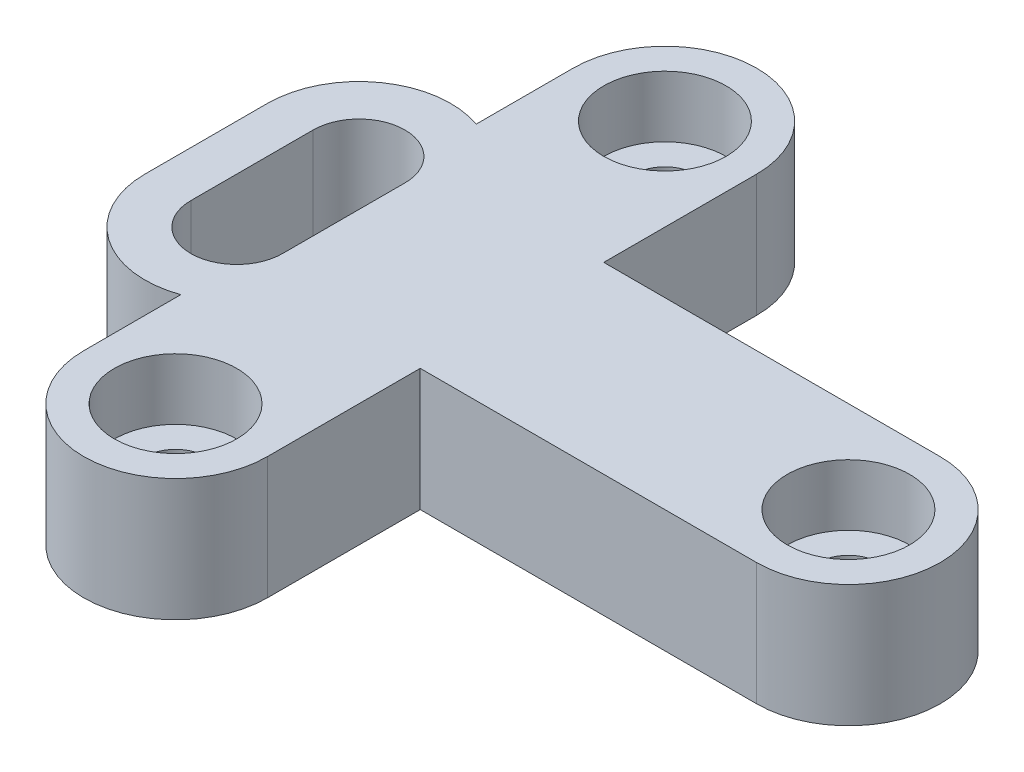
ISO-10303-21;
HEADER;
FILE_DESCRIPTION(('STEP AP214'),'2;1');
FILE_NAME('part.step','',(''),(''),'','','');
FILE_SCHEMA(('AUTOMOTIVE_DESIGN { 1 0 10303 214 1 1 1 1 }'));
ENDSEC;
DATA;
#1=APPLICATION_CONTEXT('core data for automotive mechanical design processes');
#2=APPLICATION_PROTOCOL_DEFINITION('international standard','automotive_design',2000,#1);
#3=PRODUCT_CONTEXT('',#1,'mechanical');
#4=PRODUCT('Part','Part','',(#3));
#5=PRODUCT_RELATED_PRODUCT_CATEGORY('part','',(#4));
#6=PRODUCT_DEFINITION_FORMATION('','',#4);
#7=PRODUCT_DEFINITION_CONTEXT('part definition',#1,'design');
#8=PRODUCT_DEFINITION('design','',#6,#7);
#9=PRODUCT_DEFINITION_SHAPE('','',#8);
#10=(LENGTH_UNIT() NAMED_UNIT(*) SI_UNIT(.MILLI.,.METRE.));
#11=(NAMED_UNIT(*) PLANE_ANGLE_UNIT() SI_UNIT($,.RADIAN.));
#12=(NAMED_UNIT(*) SI_UNIT($,.STERADIAN.) SOLID_ANGLE_UNIT());
#13=UNCERTAINTY_MEASURE_WITH_UNIT(LENGTH_MEASURE(1.E-05),#10,'distance_accuracy_value','');
#14=(GEOMETRIC_REPRESENTATION_CONTEXT(3) GLOBAL_UNCERTAINTY_ASSIGNED_CONTEXT((#13)) GLOBAL_UNIT_ASSIGNED_CONTEXT((#10,
#11,#12)) REPRESENTATION_CONTEXT('',''));
#15=CARTESIAN_POINT('',(0.,0.,0.));
#16=DIRECTION('',(0.,0.,1.));
#17=DIRECTION('',(1.,0.,0.));
#18=AXIS2_PLACEMENT_3D('',#15,#16,#17);
#19=CARTESIAN_POINT('',(20.,10.,40.));
#20=DIRECTION('',(0.,-1.,0.));
#21=DIRECTION('',(0.,0.,-1.));
#22=AXIS2_PLACEMENT_3D('',#19,#20,#21);
#23=CYLINDRICAL_SURFACE('',#22,5.00000000000001);
#24=CARTESIAN_POINT('',(20.,-10.,40.));
#25=DIRECTION('',(0.,1.,0.));
#26=DIRECTION('',(0.,0.,1.));
#27=AXIS2_PLACEMENT_3D('',#24,#25,#26);
#28=CIRCLE('',#27,5.00000000000001);
#29=CARTESIAN_POINT('',(20.,-10.,45.));
#30=VERTEX_POINT('',#29);
#31=EDGE_CURVE('E195',#30,#30,#28,.T.);
#32=ORIENTED_EDGE('',*,*,#31,.F.);
#33=EDGE_LOOP('',(#32));
#34=FACE_BOUND('',#33,.T.);
#35=CARTESIAN_POINT('',(20.,0.,40.));
#36=DIRECTION('',(0.,1.,0.));
#37=DIRECTION('',(0.,0.,1.));
#38=AXIS2_PLACEMENT_3D('',#35,#36,#37);
#39=CIRCLE('',#38,5.00000000000001);
#40=CARTESIAN_POINT('',(20.,0.,45.));
#41=VERTEX_POINT('',#40);
#42=EDGE_CURVE('E41',#41,#41,#39,.T.);
#43=ORIENTED_EDGE('',*,*,#42,.T.);
#44=EDGE_LOOP('',(#43));
#45=FACE_BOUND('',#44,.T.);
#46=ADVANCED_FACE('F37',(#34,#45),#23,.F.);
#47=CARTESIAN_POINT('',(20.,10.,-40.));
#48=DIRECTION('',(0.,-1.,0.));
#49=DIRECTION('',(0.,0.,-1.));
#50=AXIS2_PLACEMENT_3D('',#47,#48,#49);
#51=CYLINDRICAL_SURFACE('',#50,5.00000000000001);
#52=CARTESIAN_POINT('',(20.,-10.,-40.));
#53=DIRECTION('',(0.,1.,0.));
#54=DIRECTION('',(0.,0.,1.));
#55=AXIS2_PLACEMENT_3D('',#52,#53,#54);
#56=CIRCLE('',#55,5.00000000000001);
#57=CARTESIAN_POINT('',(20.,-10.,-35.));
#58=VERTEX_POINT('',#57);
#59=EDGE_CURVE('E192',#58,#58,#56,.T.);
#60=ORIENTED_EDGE('',*,*,#59,.F.);
#61=EDGE_LOOP('',(#60));
#62=FACE_BOUND('',#61,.T.);
#63=CARTESIAN_POINT('',(20.,0.,-40.));
#64=DIRECTION('',(0.,1.,0.));
#65=DIRECTION('',(0.,0.,1.));
#66=AXIS2_PLACEMENT_3D('',#63,#64,#65);
#67=CIRCLE('',#66,5.00000000000001);
#68=CARTESIAN_POINT('',(20.,0.,-35.));
#69=VERTEX_POINT('',#68);
#70=EDGE_CURVE('E282',#69,#69,#67,.T.);
#71=ORIENTED_EDGE('',*,*,#70,.T.);
#72=EDGE_LOOP('',(#71));
#73=FACE_BOUND('',#72,.T.);
#74=ADVANCED_FACE('F404',(#62,#73),#51,.F.);
#75=CARTESIAN_POINT('',(90.,10.,0.));
#76=DIRECTION('',(0.,-1.,0.));
#77=DIRECTION('',(0.,0.,-1.));
#78=AXIS2_PLACEMENT_3D('',#75,#76,#77);
#79=CYLINDRICAL_SURFACE('',#78,4.99999999999999);
#80=CARTESIAN_POINT('',(90.,-10.,0.));
#81=DIRECTION('',(0.,1.,0.));
#82=DIRECTION('',(0.,0.,1.));
#83=AXIS2_PLACEMENT_3D('',#80,#81,#82);
#84=CIRCLE('',#83,4.99999999999999);
#85=CARTESIAN_POINT('',(90.,-10.,5.));
#86=VERTEX_POINT('',#85);
#87=EDGE_CURVE('E168',#86,#86,#84,.T.);
#88=ORIENTED_EDGE('',*,*,#87,.F.);
#89=EDGE_LOOP('',(#88));
#90=FACE_BOUND('',#89,.T.);
#91=CARTESIAN_POINT('',(90.,0.,0.));
#92=DIRECTION('',(0.,1.,0.));
#93=DIRECTION('',(0.,0.,1.));
#94=AXIS2_PLACEMENT_3D('',#91,#92,#93);
#95=CIRCLE('',#94,4.99999999999999);
#96=CARTESIAN_POINT('',(90.,0.,5.));
#97=VERTEX_POINT('',#96);
#98=EDGE_CURVE('E280',#97,#97,#95,.T.);
#99=ORIENTED_EDGE('',*,*,#98,.T.);
#100=EDGE_LOOP('',(#99));
#101=FACE_BOUND('',#100,.T.);
#102=ADVANCED_FACE('F328',(#90,#101),#79,.F.);
#103=CARTESIAN_POINT('',(20.,10.,-40.));
#104=DIRECTION('',(0.,1.,0.));
#105=DIRECTION('',(0.,0.,1.));
#106=AXIS2_PLACEMENT_3D('',#103,#104,#105);
#107=PLANE('',#106);
#108=CARTESIAN_POINT('',(20.,10.,40.));
#109=DIRECTION('',(0.,1.,0.));
#110=DIRECTION('',(0.,0.,1.));
#111=AXIS2_PLACEMENT_3D('',#108,#109,#110);
#112=CIRCLE('',#111,10.);
#113=CARTESIAN_POINT('',(20.,10.,50.));
#114=VERTEX_POINT('',#113);
#115=EDGE_CURVE('E299',#114,#114,#112,.T.);
#116=ORIENTED_EDGE('',*,*,#115,.F.);
#117=EDGE_LOOP('',(#116));
#118=FACE_BOUND('',#117,.T.);
#119=CARTESIAN_POINT('',(20.,10.,-40.));
#120=DIRECTION('',(0.,1.,0.));
#121=DIRECTION('',(0.,0.,1.));
#122=AXIS2_PLACEMENT_3D('',#119,#120,#121);
#123=CIRCLE('',#122,10.);
#124=CARTESIAN_POINT('',(20.,10.,-30.));
#125=VERTEX_POINT('',#124);
#126=EDGE_CURVE('E302',#125,#125,#123,.T.);
#127=ORIENTED_EDGE('',*,*,#126,.F.);
#128=EDGE_LOOP('',(#127));
#129=FACE_BOUND('',#128,.T.);
#130=CARTESIAN_POINT('',(90.,10.,0.));
#131=DIRECTION('',(0.,1.,0.));
#132=DIRECTION('',(0.,0.,1.));
#133=AXIS2_PLACEMENT_3D('',#130,#131,#132);
#134=CIRCLE('',#133,9.99999999999999);
#135=CARTESIAN_POINT('',(90.,10.,10.));
#136=VERTEX_POINT('',#135);
#137=EDGE_CURVE('E310',#136,#136,#134,.T.);
#138=ORIENTED_EDGE('',*,*,#137,.F.);
#139=EDGE_LOOP('',(#138));
#140=FACE_BOUND('',#139,.T.);
#141=CARTESIAN_POINT('',(20.,10.,-40.));
#142=DIRECTION('',(0.,1.,0.));
#143=DIRECTION('',(0.,0.,1.));
#144=AXIS2_PLACEMENT_3D('',#141,#142,#143);
#145=CIRCLE('',#144,15.);
#146=CARTESIAN_POINT('',(35.,10.,-40.));
#147=VERTEX_POINT('',#146);
#148=CARTESIAN_POINT('',(5.,10.,-40.));
#149=VERTEX_POINT('',#148);
#150=EDGE_CURVE('E199',#147,#149,#145,.T.);
#151=ORIENTED_EDGE('',*,*,#150,.T.);
#152=DIRECTION('',(0.,0.,1.));
#153=VECTOR('',#152,1.);
#154=CARTESIAN_POINT('',(5.,10.,-40.));
#155=LINE('',#154,#153);
#156=CARTESIAN_POINT('',(5.00000000000001,10.,-24.142135623731));
#157=VERTEX_POINT('',#156);
#158=EDGE_CURVE('E202',#149,#157,#155,.T.);
#159=ORIENTED_EDGE('',*,*,#158,.T.);
#160=CARTESIAN_POINT('',(0.,10.,-10.));
#161=DIRECTION('',(0.,1.,0.));
#162=DIRECTION('',(0.,0.,1.));
#163=AXIS2_PLACEMENT_3D('',#160,#161,#162);
#164=CIRCLE('',#163,15.);
#165=CARTESIAN_POINT('',(-15.,10.,-10.));
#166=VERTEX_POINT('',#165);
#167=EDGE_CURVE('E205',#157,#166,#164,.T.);
#168=ORIENTED_EDGE('',*,*,#167,.T.);
#169=DIRECTION('',(0.,0.,1.));
#170=VECTOR('',#169,1.);
#171=CARTESIAN_POINT('',(-15.,10.,-10.));
#172=LINE('',#171,#170);
#173=CARTESIAN_POINT('',(-15.,10.,9.99999999999999));
#174=VERTEX_POINT('',#173);
#175=EDGE_CURVE('E207',#166,#174,#172,.T.);
#176=ORIENTED_EDGE('',*,*,#175,.T.);
#177=CARTESIAN_POINT('',(0.,10.,9.99999999999999));
#178=DIRECTION('',(0.,1.,0.));
#179=DIRECTION('',(0.,0.,1.));
#180=AXIS2_PLACEMENT_3D('',#177,#178,#179);
#181=CIRCLE('',#180,15.);
#182=CARTESIAN_POINT('',(5.00000000000001,10.,24.1421356237309));
#183=VERTEX_POINT('',#182);
#184=EDGE_CURVE('E209',#174,#183,#181,.T.);
#185=ORIENTED_EDGE('',*,*,#184,.T.);
#186=DIRECTION('',(0.,0.,1.));
#187=VECTOR('',#186,1.);
#188=CARTESIAN_POINT('',(5.00000000000001,10.,40.));
#189=LINE('',#188,#187);
#190=CARTESIAN_POINT('',(5.00000000000001,10.,40.));
#191=VERTEX_POINT('',#190);
#192=EDGE_CURVE('E211',#183,#191,#189,.T.);
#193=ORIENTED_EDGE('',*,*,#192,.T.);
#194=CARTESIAN_POINT('',(20.,10.,40.));
#195=DIRECTION('',(0.,1.,0.));
#196=DIRECTION('',(0.,0.,1.));
#197=AXIS2_PLACEMENT_3D('',#194,#195,#196);
#198=CIRCLE('',#197,15.);
#199=CARTESIAN_POINT('',(35.,10.,40.));
#200=VERTEX_POINT('',#199);
#201=EDGE_CURVE('E213',#191,#200,#198,.T.);
#202=ORIENTED_EDGE('',*,*,#201,.T.);
#203=DIRECTION('',(0.,0.,-1.));
#204=VECTOR('',#203,1.);
#205=CARTESIAN_POINT('',(35.,10.,40.));
#206=LINE('',#205,#204);
#207=CARTESIAN_POINT('',(35.,10.,15.));
#208=VERTEX_POINT('',#207);
#209=EDGE_CURVE('E215',#200,#208,#206,.T.);
#210=ORIENTED_EDGE('',*,*,#209,.T.);
#211=DIRECTION('',(1.,0.,0.));
#212=VECTOR('',#211,1.);
#213=CARTESIAN_POINT('',(35.,10.,15.));
#214=LINE('',#213,#212);
#215=CARTESIAN_POINT('',(90.,10.,15.));
#216=VERTEX_POINT('',#215);
#217=EDGE_CURVE('E217',#208,#216,#214,.T.);
#218=ORIENTED_EDGE('',*,*,#217,.T.);
#219=CARTESIAN_POINT('',(90.,10.,0.));
#220=DIRECTION('',(0.,1.,0.));
#221=DIRECTION('',(0.,0.,1.));
#222=AXIS2_PLACEMENT_3D('',#219,#220,#221);
#223=CIRCLE('',#222,15.);
#224=CARTESIAN_POINT('',(90.,10.,-15.));
#225=VERTEX_POINT('',#224);
#226=EDGE_CURVE('E219',#216,#225,#223,.T.);
#227=ORIENTED_EDGE('',*,*,#226,.T.);
#228=DIRECTION('',(-1.,0.,0.));
#229=VECTOR('',#228,1.);
#230=CARTESIAN_POINT('',(90.,10.,-15.));
#231=LINE('',#230,#229);
#232=CARTESIAN_POINT('',(35.,10.,-15.));
#233=VERTEX_POINT('',#232);
#234=EDGE_CURVE('E221',#225,#233,#231,.T.);
#235=ORIENTED_EDGE('',*,*,#234,.T.);
#236=DIRECTION('',(0.,0.,-1.));
#237=VECTOR('',#236,1.);
#238=CARTESIAN_POINT('',(35.,10.,-15.));
#239=LINE('',#238,#237);
#240=EDGE_CURVE('E223',#233,#147,#239,.T.);
#241=ORIENTED_EDGE('',*,*,#240,.T.);
#242=EDGE_LOOP('',(#151,#159,#168,#176,#185,#193,#202,#210,#218,#227,#235,#241));
#243=FACE_BOUND('',#242,.T.);
#244=DIRECTION('',(0.,0.,1.));
#245=VECTOR('',#244,1.);
#246=CARTESIAN_POINT('',(-7.50000000000001,10.,-10.));
#247=LINE('',#246,#245);
#248=CARTESIAN_POINT('',(-7.50000000000001,10.,-10.));
#249=VERTEX_POINT('',#248);
#250=CARTESIAN_POINT('',(-7.5,10.,9.99999999999999));
#251=VERTEX_POINT('',#250);
#252=EDGE_CURVE('E160',#249,#251,#247,.T.);
#253=ORIENTED_EDGE('',*,*,#252,.F.);
#254=CARTESIAN_POINT('',(0.,10.,-10.));
#255=DIRECTION('',(0.,1.,0.));
#256=DIRECTION('',(0.,0.,1.));
#257=AXIS2_PLACEMENT_3D('',#254,#255,#256);
#258=CIRCLE('',#257,7.5);
#259=CARTESIAN_POINT('',(7.5,10.,-10.));
#260=VERTEX_POINT('',#259);
#261=EDGE_CURVE('E152',#260,#249,#258,.T.);
#262=ORIENTED_EDGE('',*,*,#261,.F.);
#263=DIRECTION('',(0.,0.,-1.));
#264=VECTOR('',#263,1.);
#265=CARTESIAN_POINT('',(7.5,10.,-10.));
#266=LINE('',#265,#264);
#267=CARTESIAN_POINT('',(7.50000000000001,10.,9.99999999999999));
#268=VERTEX_POINT('',#267);
#269=EDGE_CURVE('E175',#268,#260,#266,.T.);
#270=ORIENTED_EDGE('',*,*,#269,.F.);
#271=CARTESIAN_POINT('',(0.,10.,9.99999999999999));
#272=DIRECTION('',(0.,1.,0.));
#273=DIRECTION('',(0.,0.,1.));
#274=AXIS2_PLACEMENT_3D('',#271,#272,#273);
#275=CIRCLE('',#274,7.5);
#276=EDGE_CURVE('E173',#251,#268,#275,.T.);
#277=ORIENTED_EDGE('',*,*,#276,.F.);
#278=EDGE_LOOP('',(#253,#262,#270,#277));
#279=FACE_BOUND('',#278,.T.);
#280=ADVANCED_FACE('F172',(#118,#129,#140,#243,#279),#107,.T.);
#281=CARTESIAN_POINT('',(20.,-10.,-40.));
#282=DIRECTION('',(0.,1.,0.));
#283=DIRECTION('',(0.,0.,1.));
#284=AXIS2_PLACEMENT_3D('',#281,#282,#283);
#285=PLANE('',#284);
#286=ORIENTED_EDGE('',*,*,#87,.T.);
#287=EDGE_LOOP('',(#286));
#288=FACE_BOUND('',#287,.T.);
#289=ORIENTED_EDGE('',*,*,#59,.T.);
#290=EDGE_LOOP('',(#289));
#291=FACE_BOUND('',#290,.T.);
#292=ORIENTED_EDGE('',*,*,#31,.T.);
#293=EDGE_LOOP('',(#292));
#294=FACE_BOUND('',#293,.T.);
#295=CARTESIAN_POINT('',(20.,-10.,-40.));
#296=DIRECTION('',(0.,1.,0.));
#297=DIRECTION('',(0.,0.,1.));
#298=AXIS2_PLACEMENT_3D('',#295,#296,#297);
#299=CIRCLE('',#298,15.);
#300=CARTESIAN_POINT('',(35.,-10.,-40.));
#301=VERTEX_POINT('',#300);
#302=CARTESIAN_POINT('',(5.,-10.,-40.));
#303=VERTEX_POINT('',#302);
#304=EDGE_CURVE('E198',#301,#303,#299,.T.);
#305=ORIENTED_EDGE('',*,*,#304,.F.);
#306=DIRECTION('',(0.,0.,-1.));
#307=VECTOR('',#306,1.);
#308=CARTESIAN_POINT('',(35.,-10.,-15.));
#309=LINE('',#308,#307);
#310=CARTESIAN_POINT('',(35.,-10.,-15.));
#311=VERTEX_POINT('',#310);
#312=EDGE_CURVE('E203',#311,#301,#309,.T.);
#313=ORIENTED_EDGE('',*,*,#312,.F.);
#314=DIRECTION('',(-1.,0.,0.));
#315=VECTOR('',#314,1.);
#316=CARTESIAN_POINT('',(90.,-10.,-15.));
#317=LINE('',#316,#315);
#318=CARTESIAN_POINT('',(90.,-10.,-15.));
#319=VERTEX_POINT('',#318);
#320=EDGE_CURVE('E246',#319,#311,#317,.T.);
#321=ORIENTED_EDGE('',*,*,#320,.F.);
#322=CARTESIAN_POINT('',(90.,-10.,0.));
#323=DIRECTION('',(0.,1.,0.));
#324=DIRECTION('',(0.,0.,1.));
#325=AXIS2_PLACEMENT_3D('',#322,#323,#324);
#326=CIRCLE('',#325,15.);
#327=CARTESIAN_POINT('',(90.,-10.,15.));
#328=VERTEX_POINT('',#327);
#329=EDGE_CURVE('E244',#328,#319,#326,.T.);
#330=ORIENTED_EDGE('',*,*,#329,.F.);
#331=DIRECTION('',(1.,0.,0.));
#332=VECTOR('',#331,1.);
#333=CARTESIAN_POINT('',(35.,-10.,15.));
#334=LINE('',#333,#332);
#335=CARTESIAN_POINT('',(35.,-10.,15.));
#336=VERTEX_POINT('',#335);
#337=EDGE_CURVE('E242',#336,#328,#334,.T.);
#338=ORIENTED_EDGE('',*,*,#337,.F.);
#339=DIRECTION('',(0.,0.,-1.));
#340=VECTOR('',#339,1.);
#341=CARTESIAN_POINT('',(35.,-10.,40.));
#342=LINE('',#341,#340);
#343=CARTESIAN_POINT('',(35.,-10.,40.));
#344=VERTEX_POINT('',#343);
#345=EDGE_CURVE('E240',#344,#336,#342,.T.);
#346=ORIENTED_EDGE('',*,*,#345,.F.);
#347=CARTESIAN_POINT('',(20.,-10.,40.));
#348=DIRECTION('',(0.,1.,0.));
#349=DIRECTION('',(0.,0.,1.));
#350=AXIS2_PLACEMENT_3D('',#347,#348,#349);
#351=CIRCLE('',#350,15.);
#352=CARTESIAN_POINT('',(5.00000000000001,-10.,40.));
#353=VERTEX_POINT('',#352);
#354=EDGE_CURVE('E238',#353,#344,#351,.T.);
#355=ORIENTED_EDGE('',*,*,#354,.F.);
#356=DIRECTION('',(0.,0.,1.));
#357=VECTOR('',#356,1.);
#358=CARTESIAN_POINT('',(5.00000000000001,-10.,40.));
#359=LINE('',#358,#357);
#360=CARTESIAN_POINT('',(5.00000000000001,-10.,24.1421356237309));
#361=VERTEX_POINT('',#360);
#362=EDGE_CURVE('E236',#361,#353,#359,.T.);
#363=ORIENTED_EDGE('',*,*,#362,.F.);
#364=CARTESIAN_POINT('',(0.,-10.,9.99999999999999));
#365=DIRECTION('',(0.,1.,0.));
#366=DIRECTION('',(0.,0.,1.));
#367=AXIS2_PLACEMENT_3D('',#364,#365,#366);
#368=CIRCLE('',#367,15.);
#369=CARTESIAN_POINT('',(-15.,-10.,9.99999999999999));
#370=VERTEX_POINT('',#369);
#371=EDGE_CURVE('E234',#370,#361,#368,.T.);
#372=ORIENTED_EDGE('',*,*,#371,.F.);
#373=DIRECTION('',(0.,0.,1.));
#374=VECTOR('',#373,1.);
#375=CARTESIAN_POINT('',(-15.,-10.,-10.));
#376=LINE('',#375,#374);
#377=CARTESIAN_POINT('',(-15.,-10.,-10.));
#378=VERTEX_POINT('',#377);
#379=EDGE_CURVE('E232',#378,#370,#376,.T.);
#380=ORIENTED_EDGE('',*,*,#379,.F.);
#381=CARTESIAN_POINT('',(0.,-10.,-10.));
#382=DIRECTION('',(0.,1.,0.));
#383=DIRECTION('',(0.,0.,1.));
#384=AXIS2_PLACEMENT_3D('',#381,#382,#383);
#385=CIRCLE('',#384,15.);
#386=CARTESIAN_POINT('',(5.00000000000001,-10.,-24.142135623731));
#387=VERTEX_POINT('',#386);
#388=EDGE_CURVE('E230',#387,#378,#385,.T.);
#389=ORIENTED_EDGE('',*,*,#388,.F.);
#390=DIRECTION('',(0.,0.,1.));
#391=VECTOR('',#390,1.);
#392=CARTESIAN_POINT('',(5.,-10.,-40.));
#393=LINE('',#392,#391);
#394=EDGE_CURVE('E228',#303,#387,#393,.T.);
#395=ORIENTED_EDGE('',*,*,#394,.F.);
#396=EDGE_LOOP('',(#305,#313,#321,#330,#338,#346,#355,#363,#372,#380,#389,#395));
#397=FACE_BOUND('',#396,.T.);
#398=CARTESIAN_POINT('',(0.,-10.,-10.));
#399=DIRECTION('',(0.,1.,0.));
#400=DIRECTION('',(0.,0.,1.));
#401=AXIS2_PLACEMENT_3D('',#398,#399,#400);
#402=CIRCLE('',#401,7.5);
#403=CARTESIAN_POINT('',(7.5,-10.,-10.));
#404=VERTEX_POINT('',#403);
#405=CARTESIAN_POINT('',(-7.50000000000001,-10.,-10.));
#406=VERTEX_POINT('',#405);
#407=EDGE_CURVE('E62',#404,#406,#402,.T.);
#408=ORIENTED_EDGE('',*,*,#407,.T.);
#409=DIRECTION('',(0.,0.,1.));
#410=VECTOR('',#409,1.);
#411=CARTESIAN_POINT('',(-7.50000000000001,-10.,-10.));
#412=LINE('',#411,#410);
#413=CARTESIAN_POINT('',(-7.5,-10.,9.99999999999999));
#414=VERTEX_POINT('',#413);
#415=EDGE_CURVE('E167',#406,#414,#412,.T.);
#416=ORIENTED_EDGE('',*,*,#415,.T.);
#417=CARTESIAN_POINT('',(0.,-10.,9.99999999999999));
#418=DIRECTION('',(0.,1.,0.));
#419=DIRECTION('',(0.,0.,1.));
#420=AXIS2_PLACEMENT_3D('',#417,#418,#419);
#421=CIRCLE('',#420,7.5);
#422=CARTESIAN_POINT('',(7.50000000000001,-10.,9.99999999999999));
#423=VERTEX_POINT('',#422);
#424=EDGE_CURVE('E182',#414,#423,#421,.T.);
#425=ORIENTED_EDGE('',*,*,#424,.T.);
#426=DIRECTION('',(0.,0.,-1.));
#427=VECTOR('',#426,1.);
#428=CARTESIAN_POINT('',(7.5,-10.,-10.));
#429=LINE('',#428,#427);
#430=EDGE_CURVE('E161',#423,#404,#429,.T.);
#431=ORIENTED_EDGE('',*,*,#430,.T.);
#432=EDGE_LOOP('',(#408,#416,#425,#431));
#433=FACE_BOUND('',#432,.T.);
#434=ADVANCED_FACE('F327',(#288,#291,#294,#397,#433),#285,.F.);
#435=CARTESIAN_POINT('',(20.,10.,-40.));
#436=DIRECTION('',(0.,-1.,0.));
#437=DIRECTION('',(0.,0.,-1.));
#438=AXIS2_PLACEMENT_3D('',#435,#436,#437);
#439=CYLINDRICAL_SURFACE('',#438,15.);
#440=ORIENTED_EDGE('',*,*,#304,.T.);
#441=DIRECTION('',(0.,-1.,0.));
#442=VECTOR('',#441,1.);
#443=CARTESIAN_POINT('',(5.,10.,-40.));
#444=LINE('',#443,#442);
#445=EDGE_CURVE('E11',#149,#303,#444,.T.);
#446=ORIENTED_EDGE('',*,*,#445,.F.);
#447=ORIENTED_EDGE('',*,*,#150,.F.);
#448=DIRECTION('',(0.,-1.,0.));
#449=VECTOR('',#448,1.);
#450=CARTESIAN_POINT('',(35.,10.,-40.));
#451=LINE('',#450,#449);
#452=EDGE_CURVE('E225',#147,#301,#451,.T.);
#453=ORIENTED_EDGE('',*,*,#452,.T.);
#454=EDGE_LOOP('',(#440,#446,#447,#453));
#455=FACE_BOUND('',#454,.T.);
#456=ADVANCED_FACE('F39',(#455),#439,.T.);
#457=CARTESIAN_POINT('',(5.,10.,-40.));
#458=DIRECTION('',(1.,0.,0.));
#459=DIRECTION('',(0.,0.,-1.));
#460=AXIS2_PLACEMENT_3D('',#457,#458,#459);
#461=PLANE('',#460);
#462=ORIENTED_EDGE('',*,*,#394,.T.);
#463=DIRECTION('',(0.,-1.,0.));
#464=VECTOR('',#463,1.);
#465=CARTESIAN_POINT('',(5.00000000000001,10.,-24.142135623731));
#466=LINE('',#465,#464);
#467=EDGE_CURVE('E46',#157,#387,#466,.T.);
#468=ORIENTED_EDGE('',*,*,#467,.F.);
#469=ORIENTED_EDGE('',*,*,#158,.F.);
#470=ORIENTED_EDGE('',*,*,#445,.T.);
#471=EDGE_LOOP('',(#462,#468,#469,#470));
#472=FACE_BOUND('',#471,.T.);
#473=ADVANCED_FACE('F339',(#472),#461,.F.);
#474=CARTESIAN_POINT('',(0.,10.,-10.));
#475=DIRECTION('',(0.,-1.,0.));
#476=DIRECTION('',(0.,0.,-1.));
#477=AXIS2_PLACEMENT_3D('',#474,#475,#476);
#478=CYLINDRICAL_SURFACE('',#477,15.);
#479=ORIENTED_EDGE('',*,*,#388,.T.);
#480=DIRECTION('',(0.,-1.,0.));
#481=VECTOR('',#480,1.);
#482=CARTESIAN_POINT('',(-15.,10.,-10.));
#483=LINE('',#482,#481);
#484=EDGE_CURVE('E275',#166,#378,#483,.T.);
#485=ORIENTED_EDGE('',*,*,#484,.F.);
#486=ORIENTED_EDGE('',*,*,#167,.F.);
#487=ORIENTED_EDGE('',*,*,#467,.T.);
#488=EDGE_LOOP('',(#479,#485,#486,#487));
#489=FACE_BOUND('',#488,.T.);
#490=ADVANCED_FACE('F344',(#489),#478,.T.);
#491=CARTESIAN_POINT('',(-15.,10.,-10.));
#492=DIRECTION('',(1.,0.,0.));
#493=DIRECTION('',(0.,0.,-1.));
#494=AXIS2_PLACEMENT_3D('',#491,#492,#493);
#495=PLANE('',#494);
#496=ORIENTED_EDGE('',*,*,#379,.T.);
#497=DIRECTION('',(0.,-1.,0.));
#498=VECTOR('',#497,1.);
#499=CARTESIAN_POINT('',(-15.,10.,9.99999999999999));
#500=LINE('',#499,#498);
#501=EDGE_CURVE('E272',#174,#370,#500,.T.);
#502=ORIENTED_EDGE('',*,*,#501,.F.);
#503=ORIENTED_EDGE('',*,*,#175,.F.);
#504=ORIENTED_EDGE('',*,*,#484,.T.);
#505=EDGE_LOOP('',(#496,#502,#503,#504));
#506=FACE_BOUND('',#505,.T.);
#507=ADVANCED_FACE('F350',(#506),#495,.F.);
#508=CARTESIAN_POINT('',(0.,10.,9.99999999999999));
#509=DIRECTION('',(0.,-1.,0.));
#510=DIRECTION('',(0.,0.,-1.));
#511=AXIS2_PLACEMENT_3D('',#508,#509,#510);
#512=CYLINDRICAL_SURFACE('',#511,15.);
#513=ORIENTED_EDGE('',*,*,#371,.T.);
#514=DIRECTION('',(0.,-1.,0.));
#515=VECTOR('',#514,1.);
#516=CARTESIAN_POINT('',(5.00000000000001,10.,24.1421356237309));
#517=LINE('',#516,#515);
#518=EDGE_CURVE('E269',#183,#361,#517,.T.);
#519=ORIENTED_EDGE('',*,*,#518,.F.);
#520=ORIENTED_EDGE('',*,*,#184,.F.);
#521=ORIENTED_EDGE('',*,*,#501,.T.);
#522=EDGE_LOOP('',(#513,#519,#520,#521));
#523=FACE_BOUND('',#522,.T.);
#524=ADVANCED_FACE('F354',(#523),#512,.T.);
#525=CARTESIAN_POINT('',(5.00000000000001,10.,40.));
#526=DIRECTION('',(1.,0.,0.));
#527=DIRECTION('',(0.,0.,-1.));
#528=AXIS2_PLACEMENT_3D('',#525,#526,#527);
#529=PLANE('',#528);
#530=ORIENTED_EDGE('',*,*,#362,.T.);
#531=DIRECTION('',(0.,-1.,0.));
#532=VECTOR('',#531,1.);
#533=CARTESIAN_POINT('',(5.00000000000001,10.,40.));
#534=LINE('',#533,#532);
#535=EDGE_CURVE('E266',#191,#353,#534,.T.);
#536=ORIENTED_EDGE('',*,*,#535,.F.);
#537=ORIENTED_EDGE('',*,*,#192,.F.);
#538=ORIENTED_EDGE('',*,*,#518,.T.);
#539=EDGE_LOOP('',(#530,#536,#537,#538));
#540=FACE_BOUND('',#539,.T.);
#541=ADVANCED_FACE('F359',(#540),#529,.F.);
#542=CARTESIAN_POINT('',(20.,10.,40.));
#543=DIRECTION('',(0.,-1.,0.));
#544=DIRECTION('',(0.,0.,-1.));
#545=AXIS2_PLACEMENT_3D('',#542,#543,#544);
#546=CYLINDRICAL_SURFACE('',#545,15.);
#547=ORIENTED_EDGE('',*,*,#354,.T.);
#548=DIRECTION('',(0.,-1.,0.));
#549=VECTOR('',#548,1.);
#550=CARTESIAN_POINT('',(35.,10.,40.));
#551=LINE('',#550,#549);
#552=EDGE_CURVE('E263',#200,#344,#551,.T.);
#553=ORIENTED_EDGE('',*,*,#552,.F.);
#554=ORIENTED_EDGE('',*,*,#201,.F.);
#555=ORIENTED_EDGE('',*,*,#535,.T.);
#556=EDGE_LOOP('',(#547,#553,#554,#555));
#557=FACE_BOUND('',#556,.T.);
#558=ADVANCED_FACE('F365',(#557),#546,.T.);
#559=CARTESIAN_POINT('',(35.,10.,40.));
#560=DIRECTION('',(-1.,0.,0.));
#561=DIRECTION('',(0.,0.,1.));
#562=AXIS2_PLACEMENT_3D('',#559,#560,#561);
#563=PLANE('',#562);
#564=ORIENTED_EDGE('',*,*,#345,.T.);
#565=DIRECTION('',(0.,-1.,0.));
#566=VECTOR('',#565,1.);
#567=CARTESIAN_POINT('',(35.,10.,15.));
#568=LINE('',#567,#566);
#569=EDGE_CURVE('E260',#208,#336,#568,.T.);
#570=ORIENTED_EDGE('',*,*,#569,.F.);
#571=ORIENTED_EDGE('',*,*,#209,.F.);
#572=ORIENTED_EDGE('',*,*,#552,.T.);
#573=EDGE_LOOP('',(#564,#570,#571,#572));
#574=FACE_BOUND('',#573,.T.);
#575=ADVANCED_FACE('F369',(#574),#563,.F.);
#576=CARTESIAN_POINT('',(35.,10.,15.));
#577=DIRECTION('',(0.,0.,-1.));
#578=DIRECTION('',(-1.,0.,0.));
#579=AXIS2_PLACEMENT_3D('',#576,#577,#578);
#580=PLANE('',#579);
#581=ORIENTED_EDGE('',*,*,#337,.T.);
#582=DIRECTION('',(0.,-1.,0.));
#583=VECTOR('',#582,1.);
#584=CARTESIAN_POINT('',(90.,10.,15.));
#585=LINE('',#584,#583);
#586=EDGE_CURVE('E257',#216,#328,#585,.T.);
#587=ORIENTED_EDGE('',*,*,#586,.F.);
#588=ORIENTED_EDGE('',*,*,#217,.F.);
#589=ORIENTED_EDGE('',*,*,#569,.T.);
#590=EDGE_LOOP('',(#581,#587,#588,#589));
#591=FACE_BOUND('',#590,.T.);
#592=ADVANCED_FACE('F374',(#591),#580,.F.);
#593=CARTESIAN_POINT('',(90.,10.,0.));
#594=DIRECTION('',(0.,-1.,0.));
#595=DIRECTION('',(0.,0.,-1.));
#596=AXIS2_PLACEMENT_3D('',#593,#594,#595);
#597=CYLINDRICAL_SURFACE('',#596,15.);
#598=ORIENTED_EDGE('',*,*,#329,.T.);
#599=DIRECTION('',(0.,-1.,0.));
#600=VECTOR('',#599,1.);
#601=CARTESIAN_POINT('',(90.,10.,-15.));
#602=LINE('',#601,#600);
#603=EDGE_CURVE('E254',#225,#319,#602,.T.);
#604=ORIENTED_EDGE('',*,*,#603,.F.);
#605=ORIENTED_EDGE('',*,*,#226,.F.);
#606=ORIENTED_EDGE('',*,*,#586,.T.);
#607=EDGE_LOOP('',(#598,#604,#605,#606));
#608=FACE_BOUND('',#607,.T.);
#609=ADVANCED_FACE('F380',(#608),#597,.T.);
#610=CARTESIAN_POINT('',(90.,10.,-15.));
#611=DIRECTION('',(0.,0.,1.));
#612=DIRECTION('',(1.,0.,0.));
#613=AXIS2_PLACEMENT_3D('',#610,#611,#612);
#614=PLANE('',#613);
#615=ORIENTED_EDGE('',*,*,#320,.T.);
#616=DIRECTION('',(0.,-1.,0.));
#617=VECTOR('',#616,1.);
#618=CARTESIAN_POINT('',(35.,10.,-15.));
#619=LINE('',#618,#617);
#620=EDGE_CURVE('E251',#233,#311,#619,.T.);
#621=ORIENTED_EDGE('',*,*,#620,.F.);
#622=ORIENTED_EDGE('',*,*,#234,.F.);
#623=ORIENTED_EDGE('',*,*,#603,.T.);
#624=EDGE_LOOP('',(#615,#621,#622,#623));
#625=FACE_BOUND('',#624,.T.);
#626=ADVANCED_FACE('F384',(#625),#614,.F.);
#627=CARTESIAN_POINT('',(35.,10.,-15.));
#628=DIRECTION('',(-1.,0.,0.));
#629=DIRECTION('',(0.,0.,1.));
#630=AXIS2_PLACEMENT_3D('',#627,#628,#629);
#631=PLANE('',#630);
#632=ORIENTED_EDGE('',*,*,#312,.T.);
#633=ORIENTED_EDGE('',*,*,#452,.F.);
#634=ORIENTED_EDGE('',*,*,#240,.F.);
#635=ORIENTED_EDGE('',*,*,#620,.T.);
#636=EDGE_LOOP('',(#632,#633,#634,#635));
#637=FACE_BOUND('',#636,.T.);
#638=ADVANCED_FACE('F387',(#637),#631,.F.);
#639=CARTESIAN_POINT('',(0.,10.,-10.));
#640=DIRECTION('',(0.,-1.,0.));
#641=DIRECTION('',(0.,0.,-1.));
#642=AXIS2_PLACEMENT_3D('',#639,#640,#641);
#643=CYLINDRICAL_SURFACE('',#642,7.5);
#644=ORIENTED_EDGE('',*,*,#407,.F.);
#645=DIRECTION('',(0.,-1.,0.));
#646=VECTOR('',#645,1.);
#647=CARTESIAN_POINT('',(7.5,10.,-10.));
#648=LINE('',#647,#646);
#649=EDGE_CURVE('E156',#260,#404,#648,.T.);
#650=ORIENTED_EDGE('',*,*,#649,.F.);
#651=ORIENTED_EDGE('',*,*,#261,.T.);
#652=DIRECTION('',(0.,-1.,0.));
#653=VECTOR('',#652,1.);
#654=CARTESIAN_POINT('',(-7.50000000000001,10.,-10.));
#655=LINE('',#654,#653);
#656=EDGE_CURVE('E155',#249,#406,#655,.T.);
#657=ORIENTED_EDGE('',*,*,#656,.T.);
#658=EDGE_LOOP('',(#644,#650,#651,#657));
#659=FACE_BOUND('',#658,.T.);
#660=ADVANCED_FACE('F154',(#659),#643,.F.);
#661=CARTESIAN_POINT('',(-7.50000000000001,10.,-10.));
#662=DIRECTION('',(1.,0.,0.));
#663=DIRECTION('',(0.,0.,-1.));
#664=AXIS2_PLACEMENT_3D('',#661,#662,#663);
#665=PLANE('',#664);
#666=ORIENTED_EDGE('',*,*,#415,.F.);
#667=ORIENTED_EDGE('',*,*,#656,.F.);
#668=ORIENTED_EDGE('',*,*,#252,.T.);
#669=DIRECTION('',(0.,-1.,0.));
#670=VECTOR('',#669,1.);
#671=CARTESIAN_POINT('',(-7.5,10.,9.99999999999999));
#672=LINE('',#671,#670);
#673=EDGE_CURVE('E169',#251,#414,#672,.T.);
#674=ORIENTED_EDGE('',*,*,#673,.T.);
#675=EDGE_LOOP('',(#666,#667,#668,#674));
#676=FACE_BOUND('',#675,.T.);
#677=ADVANCED_FACE('F164',(#676),#665,.T.);
#678=CARTESIAN_POINT('',(0.,10.,9.99999999999999));
#679=DIRECTION('',(0.,-1.,0.));
#680=DIRECTION('',(0.,0.,-1.));
#681=AXIS2_PLACEMENT_3D('',#678,#679,#680);
#682=CYLINDRICAL_SURFACE('',#681,7.5);
#683=ORIENTED_EDGE('',*,*,#424,.F.);
#684=ORIENTED_EDGE('',*,*,#673,.F.);
#685=ORIENTED_EDGE('',*,*,#276,.T.);
#686=DIRECTION('',(0.,-1.,0.));
#687=VECTOR('',#686,1.);
#688=CARTESIAN_POINT('',(7.50000000000001,10.,9.99999999999999));
#689=LINE('',#688,#687);
#690=EDGE_CURVE('E54',#268,#423,#689,.T.);
#691=ORIENTED_EDGE('',*,*,#690,.T.);
#692=EDGE_LOOP('',(#683,#684,#685,#691));
#693=FACE_BOUND('',#692,.T.);
#694=ADVANCED_FACE('F395',(#693),#682,.F.);
#695=CARTESIAN_POINT('',(7.5,10.,-10.));
#696=DIRECTION('',(-1.,0.,0.));
#697=DIRECTION('',(0.,0.,1.));
#698=AXIS2_PLACEMENT_3D('',#695,#696,#697);
#699=PLANE('',#698);
#700=ORIENTED_EDGE('',*,*,#430,.F.);
#701=ORIENTED_EDGE('',*,*,#690,.F.);
#702=ORIENTED_EDGE('',*,*,#269,.T.);
#703=ORIENTED_EDGE('',*,*,#649,.T.);
#704=EDGE_LOOP('',(#700,#701,#702,#703));
#705=FACE_BOUND('',#704,.T.);
#706=ADVANCED_FACE('F321',(#705),#699,.T.);
#707=CARTESIAN_POINT('',(90.,0.,0.));
#708=DIRECTION('',(0.,1.,0.));
#709=DIRECTION('',(0.,0.,1.));
#710=AXIS2_PLACEMENT_3D('',#707,#708,#709);
#711=CYLINDRICAL_SURFACE('',#710,9.99999999999999);
#712=CARTESIAN_POINT('',(90.,0.,0.));
#713=DIRECTION('',(0.,1.,0.));
#714=DIRECTION('',(0.,0.,1.));
#715=AXIS2_PLACEMENT_3D('',#712,#713,#714);
#716=CIRCLE('',#715,9.99999999999999);
#717=CARTESIAN_POINT('',(90.,0.,10.));
#718=VERTEX_POINT('',#717);
#719=EDGE_CURVE('E312',#718,#718,#716,.T.);
#720=ORIENTED_EDGE('',*,*,#719,.F.);
#721=EDGE_LOOP('',(#720));
#722=FACE_BOUND('',#721,.T.);
#723=ORIENTED_EDGE('',*,*,#137,.T.);
#724=EDGE_LOOP('',(#723));
#725=FACE_BOUND('',#724,.T.);
#726=ADVANCED_FACE('F318',(#722,#725),#711,.F.);
#727=CARTESIAN_POINT('',(90.,0.,0.));
#728=DIRECTION('',(0.,1.,0.));
#729=DIRECTION('',(0.,0.,1.));
#730=AXIS2_PLACEMENT_3D('',#727,#728,#729);
#731=PLANE('',#730);
#732=ORIENTED_EDGE('',*,*,#98,.F.);
#733=EDGE_LOOP('',(#732));
#734=FACE_BOUND('',#733,.T.);
#735=ORIENTED_EDGE('',*,*,#719,.T.);
#736=EDGE_LOOP('',(#735));
#737=FACE_BOUND('',#736,.T.);
#738=ADVANCED_FACE('F316',(#734,#737),#731,.T.);
#739=CARTESIAN_POINT('',(20.,0.,-40.));
#740=DIRECTION('',(0.,1.,0.));
#741=DIRECTION('',(0.,0.,1.));
#742=AXIS2_PLACEMENT_3D('',#739,#740,#741);
#743=CYLINDRICAL_SURFACE('',#742,10.);
#744=CARTESIAN_POINT('',(20.,0.,-40.));
#745=DIRECTION('',(0.,1.,0.));
#746=DIRECTION('',(0.,0.,1.));
#747=AXIS2_PLACEMENT_3D('',#744,#745,#746);
#748=CIRCLE('',#747,10.);
#749=CARTESIAN_POINT('',(20.,0.,-30.));
#750=VERTEX_POINT('',#749);
#751=EDGE_CURVE('E307',#750,#750,#748,.T.);
#752=ORIENTED_EDGE('',*,*,#751,.F.);
#753=EDGE_LOOP('',(#752));
#754=FACE_BOUND('',#753,.T.);
#755=ORIENTED_EDGE('',*,*,#126,.T.);
#756=EDGE_LOOP('',(#755));
#757=FACE_BOUND('',#756,.T.);
#758=ADVANCED_FACE('F620',(#754,#757),#743,.F.);
#759=CARTESIAN_POINT('',(20.,0.,-40.));
#760=DIRECTION('',(0.,1.,0.));
#761=DIRECTION('',(0.,0.,1.));
#762=AXIS2_PLACEMENT_3D('',#759,#760,#761);
#763=PLANE('',#762);
#764=ORIENTED_EDGE('',*,*,#70,.F.);
#765=EDGE_LOOP('',(#764));
#766=FACE_BOUND('',#765,.T.);
#767=ORIENTED_EDGE('',*,*,#751,.T.);
#768=EDGE_LOOP('',(#767));
#769=FACE_BOUND('',#768,.T.);
#770=ADVANCED_FACE('F630',(#766,#769),#763,.T.);
#771=CARTESIAN_POINT('',(20.,0.,40.));
#772=DIRECTION('',(0.,1.,0.));
#773=DIRECTION('',(0.,0.,1.));
#774=AXIS2_PLACEMENT_3D('',#771,#772,#773);
#775=CYLINDRICAL_SURFACE('',#774,10.);
#776=CARTESIAN_POINT('',(20.,0.,40.));
#777=DIRECTION('',(0.,1.,0.));
#778=DIRECTION('',(0.,0.,1.));
#779=AXIS2_PLACEMENT_3D('',#776,#777,#778);
#780=CIRCLE('',#779,10.);
#781=CARTESIAN_POINT('',(20.,0.,50.));
#782=VERTEX_POINT('',#781);
#783=EDGE_CURVE('E283',#782,#782,#780,.T.);
#784=ORIENTED_EDGE('',*,*,#783,.F.);
#785=EDGE_LOOP('',(#784));
#786=FACE_BOUND('',#785,.T.);
#787=ORIENTED_EDGE('',*,*,#115,.T.);
#788=EDGE_LOOP('',(#787));
#789=FACE_BOUND('',#788,.T.);
#790=ADVANCED_FACE('F294',(#786,#789),#775,.F.);
#791=CARTESIAN_POINT('',(20.,0.,40.));
#792=DIRECTION('',(0.,1.,0.));
#793=DIRECTION('',(0.,0.,1.));
#794=AXIS2_PLACEMENT_3D('',#791,#792,#793);
#795=PLANE('',#794);
#796=ORIENTED_EDGE('',*,*,#42,.F.);
#797=EDGE_LOOP('',(#796));
#798=FACE_BOUND('',#797,.T.);
#799=ORIENTED_EDGE('',*,*,#783,.T.);
#800=EDGE_LOOP('',(#799));
#801=FACE_BOUND('',#800,.T.);
#802=ADVANCED_FACE('F291',(#798,#801),#795,.T.);
#803=CLOSED_SHELL('',(#46,#74,#102,#280,#434,#456,#473,#490,#507,#524,#541,#558,#575,#592,#609,
#626,#638,#660,#677,#694,#706,#726,#738,#758,#770,#790,#802));
#804=MANIFOLD_SOLID_BREP('B2',#803);
#805=ADVANCED_BREP_SHAPE_REPRESENTATION('',(#18,#804),#14);
#806=SHAPE_DEFINITION_REPRESENTATION(#9,#805);
ENDSEC;
END-ISO-10303-21;
